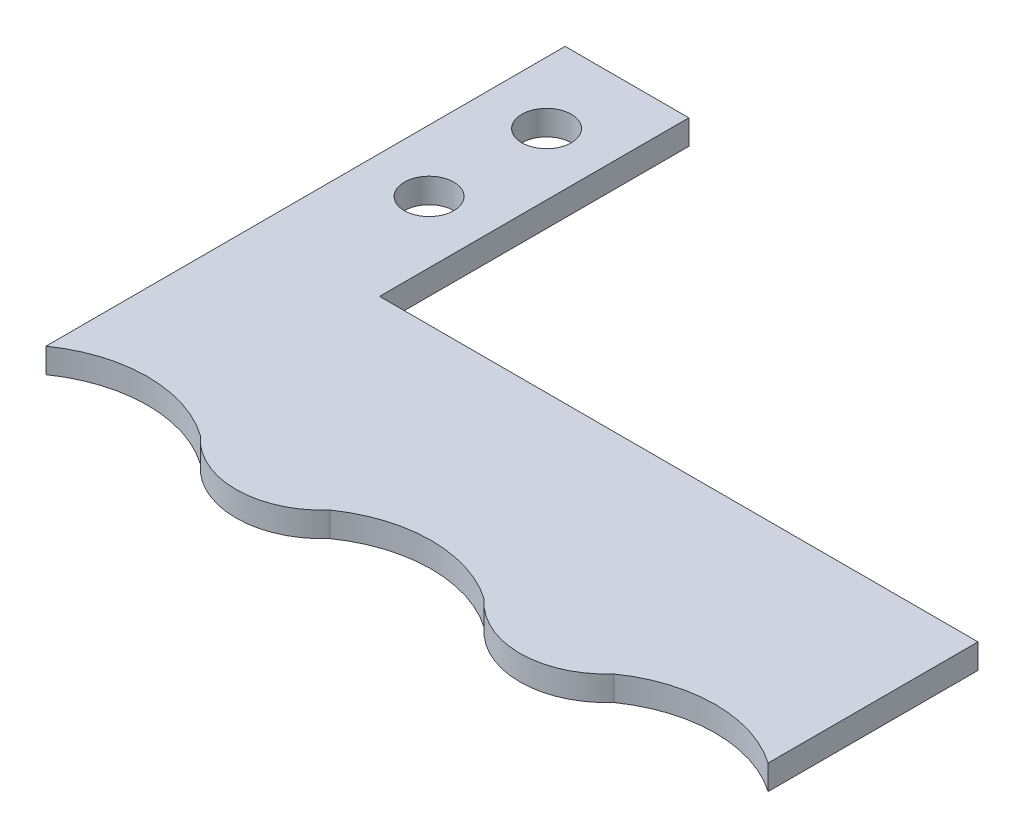
ISO-10303-21;
HEADER;
FILE_DESCRIPTION(('STEP AP214'),'2;1');
FILE_NAME('part.step','',(''),(''),'','','');
FILE_SCHEMA(('AUTOMOTIVE_DESIGN { 1 0 10303 214 1 1 1 1 }'));
ENDSEC;
DATA;
#1=APPLICATION_CONTEXT('core data for automotive mechanical design processes');
#2=APPLICATION_PROTOCOL_DEFINITION('international standard','automotive_design',2000,#1);
#3=PRODUCT_CONTEXT('',#1,'mechanical');
#4=PRODUCT('Part','Part','',(#3));
#5=PRODUCT_RELATED_PRODUCT_CATEGORY('part','',(#4));
#6=PRODUCT_DEFINITION_FORMATION('','',#4);
#7=PRODUCT_DEFINITION_CONTEXT('part definition',#1,'design');
#8=PRODUCT_DEFINITION('design','',#6,#7);
#9=PRODUCT_DEFINITION_SHAPE('','',#8);
#10=(LENGTH_UNIT() NAMED_UNIT(*) SI_UNIT(.MILLI.,.METRE.));
#11=(NAMED_UNIT(*) PLANE_ANGLE_UNIT() SI_UNIT($,.RADIAN.));
#12=(NAMED_UNIT(*) SI_UNIT($,.STERADIAN.) SOLID_ANGLE_UNIT());
#13=UNCERTAINTY_MEASURE_WITH_UNIT(LENGTH_MEASURE(1.E-05),#10,'distance_accuracy_value','');
#14=(GEOMETRIC_REPRESENTATION_CONTEXT(3) GLOBAL_UNCERTAINTY_ASSIGNED_CONTEXT((#13)) GLOBAL_UNIT_ASSIGNED_CONTEXT((#10,
#11,#12)) REPRESENTATION_CONTEXT('',''));
#15=CARTESIAN_POINT('',(0.,0.,0.));
#16=DIRECTION('',(0.,0.,1.));
#17=DIRECTION('',(1.,0.,0.));
#18=AXIS2_PLACEMENT_3D('',#15,#16,#17);
#19=CARTESIAN_POINT('',(-22.95,-2.,0.));
#20=DIRECTION('',(0.,1.,0.));
#21=DIRECTION('',(0.,0.,1.));
#22=AXIS2_PLACEMENT_3D('',#19,#20,#21);
#23=CYLINDRICAL_SURFACE('',#22,10.875);
#24=CARTESIAN_POINT('',(-22.95,0.,0.));
#25=DIRECTION('',(0.,-1.,0.));
#26=DIRECTION('',(0.,0.,-1.));
#27=AXIS2_PLACEMENT_3D('',#24,#25,#26);
#28=CIRCLE('',#27,10.875);
#29=CARTESIAN_POINT('',(-29.1876437453176,0.,-8.9082784816428));
#30=VERTEX_POINT('',#29);
#31=CARTESIAN_POINT('',(-16.7123562546824,0.,-8.9082784816428));
#32=VERTEX_POINT('',#31);
#33=EDGE_CURVE('E152',#30,#32,#28,.T.);
#34=ORIENTED_EDGE('',*,*,#33,.F.);
#35=DIRECTION('',(0.,1.,0.));
#36=VECTOR('',#35,1.);
#37=CARTESIAN_POINT('',(-29.1876437453176,-2.,-8.9082784816428));
#38=LINE('',#37,#36);
#39=CARTESIAN_POINT('',(-29.1876437453176,-2.,-8.9082784816428));
#40=VERTEX_POINT('',#39);
#41=EDGE_CURVE('E11',#40,#30,#38,.T.);
#42=ORIENTED_EDGE('',*,*,#41,.F.);
#43=CARTESIAN_POINT('',(-22.95,-2.,0.));
#44=DIRECTION('',(0.,-1.,0.));
#45=DIRECTION('',(0.,0.,-1.));
#46=AXIS2_PLACEMENT_3D('',#43,#44,#45);
#47=CIRCLE('',#46,10.875);
#48=CARTESIAN_POINT('',(-16.7123562546824,-2.,-8.9082784816428));
#49=VERTEX_POINT('',#48);
#50=EDGE_CURVE('E177',#40,#49,#47,.T.);
#51=ORIENTED_EDGE('',*,*,#50,.T.);
#52=DIRECTION('',(0.,1.,0.));
#53=VECTOR('',#52,1.);
#54=CARTESIAN_POINT('',(-16.7123562546824,-2.,-8.9082784816428));
#55=LINE('',#54,#53);
#56=EDGE_CURVE('E46',#49,#32,#55,.T.);
#57=ORIENTED_EDGE('',*,*,#56,.T.);
#58=EDGE_LOOP('',(#34,#42,#51,#57));
#59=FACE_BOUND('',#58,.T.);
#60=ADVANCED_FACE('F43',(#59),#23,.F.);
#61=CARTESIAN_POINT('',(-29.1876437453176,-2.,-8.9082784816428));
#62=DIRECTION('',(-1.,0.,0.));
#63=DIRECTION('',(0.,0.,1.));
#64=AXIS2_PLACEMENT_3D('',#61,#62,#63);
#65=PLANE('',#64);
#66=DIRECTION('',(0.,0.,1.));
#67=VECTOR('',#66,1.);
#68=CARTESIAN_POINT('',(-29.1876437453176,0.,-8.9082784816428));
#69=LINE('',#68,#67);
#70=CARTESIAN_POINT('',(-29.1876437453176,0.,-50.875));
#71=VERTEX_POINT('',#70);
#72=EDGE_CURVE('E92',#71,#30,#69,.T.);
#73=ORIENTED_EDGE('',*,*,#72,.F.);
#74=DIRECTION('',(0.,1.,0.));
#75=VECTOR('',#74,1.);
#76=CARTESIAN_POINT('',(-29.1876437453176,-2.,-50.875));
#77=LINE('',#76,#75);
#78=CARTESIAN_POINT('',(-29.1876437453176,-2.,-50.875));
#79=VERTEX_POINT('',#78);
#80=EDGE_CURVE('E52',#79,#71,#77,.T.);
#81=ORIENTED_EDGE('',*,*,#80,.F.);
#82=DIRECTION('',(0.,0.,1.));
#83=VECTOR('',#82,1.);
#84=CARTESIAN_POINT('',(-29.1876437453176,-2.,-25.875));
#85=LINE('',#84,#83);
#86=EDGE_CURVE('E60',#79,#40,#85,.T.);
#87=ORIENTED_EDGE('',*,*,#86,.T.);
#88=ORIENTED_EDGE('',*,*,#41,.T.);
#89=EDGE_LOOP('',(#73,#81,#87,#88));
#90=FACE_BOUND('',#89,.T.);
#91=ADVANCED_FACE('F251',(#90),#65,.T.);
#92=CARTESIAN_POINT('',(-29.1876437453176,-2.,-50.875));
#93=DIRECTION('',(0.,0.,-1.));
#94=DIRECTION('',(-1.,0.,0.));
#95=AXIS2_PLACEMENT_3D('',#92,#93,#94);
#96=PLANE('',#95);
#97=DIRECTION('',(-1.,0.,0.));
#98=VECTOR('',#97,1.);
#99=CARTESIAN_POINT('',(-29.1876437453176,0.,-50.875));
#100=LINE('',#99,#98);
#101=CARTESIAN_POINT('',(-19.1876437453176,0.,-50.875));
#102=VERTEX_POINT('',#101);
#103=EDGE_CURVE('E129',#102,#71,#100,.T.);
#104=ORIENTED_EDGE('',*,*,#103,.F.);
#105=DIRECTION('',(0.,1.,0.));
#106=VECTOR('',#105,1.);
#107=CARTESIAN_POINT('',(-19.1876437453176,-2.,-50.875));
#108=LINE('',#107,#106);
#109=CARTESIAN_POINT('',(-19.1876437453176,-2.,-50.875));
#110=VERTEX_POINT('',#109);
#111=EDGE_CURVE('E124',#110,#102,#108,.T.);
#112=ORIENTED_EDGE('',*,*,#111,.F.);
#113=DIRECTION('',(-1.,0.,0.));
#114=VECTOR('',#113,1.);
#115=CARTESIAN_POINT('',(-29.1876437453176,-2.,-50.875));
#116=LINE('',#115,#114);
#117=EDGE_CURVE('E127',#110,#79,#116,.T.);
#118=ORIENTED_EDGE('',*,*,#117,.T.);
#119=ORIENTED_EDGE('',*,*,#80,.T.);
#120=EDGE_LOOP('',(#104,#112,#118,#119));
#121=FACE_BOUND('',#120,.T.);
#122=ADVANCED_FACE('F126',(#121),#96,.T.);
#123=CARTESIAN_POINT('',(-19.1876437453176,-2.,-50.875));
#124=DIRECTION('',(1.,0.,0.));
#125=DIRECTION('',(0.,0.,-1.));
#126=AXIS2_PLACEMENT_3D('',#123,#124,#125);
#127=PLANE('',#126);
#128=DIRECTION('',(0.,0.,-1.));
#129=VECTOR('',#128,1.);
#130=CARTESIAN_POINT('',(-19.1876437453176,0.,-50.875));
#131=LINE('',#130,#129);
#132=CARTESIAN_POINT('',(-19.1876437453176,0.,-25.875));
#133=VERTEX_POINT('',#132);
#134=EDGE_CURVE('E174',#133,#102,#131,.T.);
#135=ORIENTED_EDGE('',*,*,#134,.F.);
#136=DIRECTION('',(0.,1.,0.));
#137=VECTOR('',#136,1.);
#138=CARTESIAN_POINT('',(-19.1876437453176,-2.,-25.875));
#139=LINE('',#138,#137);
#140=CARTESIAN_POINT('',(-19.1876437453176,-2.,-25.875));
#141=VERTEX_POINT('',#140);
#142=EDGE_CURVE('E134',#141,#133,#139,.T.);
#143=ORIENTED_EDGE('',*,*,#142,.F.);
#144=DIRECTION('',(0.,0.,-1.));
#145=VECTOR('',#144,1.);
#146=CARTESIAN_POINT('',(-19.1876437453176,-2.,-50.875));
#147=LINE('',#146,#145);
#148=EDGE_CURVE('E141',#141,#110,#147,.T.);
#149=ORIENTED_EDGE('',*,*,#148,.T.);
#150=ORIENTED_EDGE('',*,*,#111,.T.);
#151=EDGE_LOOP('',(#135,#143,#149,#150));
#152=FACE_BOUND('',#151,.T.);
#153=ADVANCED_FACE('F144',(#152),#127,.T.);
#154=CARTESIAN_POINT('',(-19.1876437453176,-2.,-25.875));
#155=DIRECTION('',(0.,0.,-1.));
#156=DIRECTION('',(-1.,0.,0.));
#157=AXIS2_PLACEMENT_3D('',#154,#155,#156);
#158=PLANE('',#157);
#159=DIRECTION('',(-1.,0.,0.));
#160=VECTOR('',#159,1.);
#161=CARTESIAN_POINT('',(-19.1876437453176,0.,-25.875));
#162=LINE('',#161,#160);
#163=CARTESIAN_POINT('',(29.1876437453176,0.,-25.875));
#164=VERTEX_POINT('',#163);
#165=EDGE_CURVE('E171',#164,#133,#162,.T.);
#166=ORIENTED_EDGE('',*,*,#165,.F.);
#167=DIRECTION('',(0.,1.,0.));
#168=VECTOR('',#167,1.);
#169=CARTESIAN_POINT('',(29.1876437453176,-2.,-25.875));
#170=LINE('',#169,#168);
#171=CARTESIAN_POINT('',(29.1876437453176,-2.,-25.875));
#172=VERTEX_POINT('',#171);
#173=EDGE_CURVE('E181',#172,#164,#170,.T.);
#174=ORIENTED_EDGE('',*,*,#173,.F.);
#175=DIRECTION('',(-1.,0.,0.));
#176=VECTOR('',#175,1.);
#177=CARTESIAN_POINT('',(-19.1876437453176,-2.,-25.875));
#178=LINE('',#177,#176);
#179=EDGE_CURVE('E145',#172,#141,#178,.T.);
#180=ORIENTED_EDGE('',*,*,#179,.T.);
#181=ORIENTED_EDGE('',*,*,#142,.T.);
#182=EDGE_LOOP('',(#166,#174,#180,#181));
#183=FACE_BOUND('',#182,.T.);
#184=ADVANCED_FACE('F198',(#183),#158,.T.);
#185=CARTESIAN_POINT('',(29.1876437453176,-2.,-8.90827848164281));
#186=DIRECTION('',(1.,0.,0.));
#187=DIRECTION('',(0.,0.,-1.));
#188=AXIS2_PLACEMENT_3D('',#185,#186,#187);
#189=PLANE('',#188);
#190=DIRECTION('',(0.,0.,-1.));
#191=VECTOR('',#190,1.);
#192=CARTESIAN_POINT('',(29.1876437453176,0.,-8.90827848164281));
#193=LINE('',#192,#191);
#194=CARTESIAN_POINT('',(29.1876437453176,0.,-8.90827848164281));
#195=VERTEX_POINT('',#194);
#196=EDGE_CURVE('E168',#195,#164,#193,.T.);
#197=ORIENTED_EDGE('',*,*,#196,.F.);
#198=DIRECTION('',(0.,1.,0.));
#199=VECTOR('',#198,1.);
#200=CARTESIAN_POINT('',(29.1876437453176,-2.,-8.90827848164281));
#201=LINE('',#200,#199);
#202=CARTESIAN_POINT('',(29.1876437453176,-2.,-8.90827848164281));
#203=VERTEX_POINT('',#202);
#204=EDGE_CURVE('E183',#203,#195,#201,.T.);
#205=ORIENTED_EDGE('',*,*,#204,.F.);
#206=DIRECTION('',(0.,0.,-1.));
#207=VECTOR('',#206,1.);
#208=CARTESIAN_POINT('',(29.1876437453176,-2.,-8.90827848164281));
#209=LINE('',#208,#207);
#210=EDGE_CURVE('E147',#203,#172,#209,.T.);
#211=ORIENTED_EDGE('',*,*,#210,.T.);
#212=ORIENTED_EDGE('',*,*,#173,.T.);
#213=EDGE_LOOP('',(#197,#205,#211,#212));
#214=FACE_BOUND('',#213,.T.);
#215=ADVANCED_FACE('F204',(#214),#189,.T.);
#216=CARTESIAN_POINT('',(22.95,-2.,0.));
#217=DIRECTION('',(0.,1.,0.));
#218=DIRECTION('',(0.,0.,1.));
#219=AXIS2_PLACEMENT_3D('',#216,#217,#218);
#220=CYLINDRICAL_SURFACE('',#219,10.875);
#221=CARTESIAN_POINT('',(22.95,0.,0.));
#222=DIRECTION('',(0.,-1.,0.));
#223=DIRECTION('',(0.,0.,-1.));
#224=AXIS2_PLACEMENT_3D('',#221,#222,#223);
#225=CIRCLE('',#224,10.875);
#226=CARTESIAN_POINT('',(16.7123562546824,0.,-8.9082784816428));
#227=VERTEX_POINT('',#226);
#228=EDGE_CURVE('E165',#227,#195,#225,.T.);
#229=ORIENTED_EDGE('',*,*,#228,.F.);
#230=DIRECTION('',(0.,1.,0.));
#231=VECTOR('',#230,1.);
#232=CARTESIAN_POINT('',(16.7123562546824,-2.,-8.9082784816428));
#233=LINE('',#232,#231);
#234=CARTESIAN_POINT('',(16.7123562546824,-2.,-8.9082784816428));
#235=VERTEX_POINT('',#234);
#236=EDGE_CURVE('E185',#235,#227,#233,.T.);
#237=ORIENTED_EDGE('',*,*,#236,.F.);
#238=CARTESIAN_POINT('',(22.95,-2.,0.));
#239=DIRECTION('',(0.,-1.,0.));
#240=DIRECTION('',(0.,0.,-1.));
#241=AXIS2_PLACEMENT_3D('',#238,#239,#240);
#242=CIRCLE('',#241,10.875);
#243=EDGE_CURVE('E205',#235,#203,#242,.T.);
#244=ORIENTED_EDGE('',*,*,#243,.T.);
#245=ORIENTED_EDGE('',*,*,#204,.T.);
#246=EDGE_LOOP('',(#229,#237,#244,#245));
#247=FACE_BOUND('',#246,.T.);
#248=ADVANCED_FACE('F267',(#247),#220,.F.);
#249=CARTESIAN_POINT('',(11.475,-2.,-13.5526405973202));
#250=DIRECTION('',(0.,1.,0.));
#251=DIRECTION('',(0.,0.,1.));
#252=AXIS2_PLACEMENT_3D('',#249,#250,#251);
#253=CYLINDRICAL_SURFACE('',#252,7.);
#254=CARTESIAN_POINT('',(11.475,0.,-13.5526405973202));
#255=DIRECTION('',(0.,1.,0.));
#256=DIRECTION('',(0.,0.,1.));
#257=AXIS2_PLACEMENT_3D('',#254,#255,#256);
#258=CIRCLE('',#257,7.);
#259=CARTESIAN_POINT('',(6.2376437453176,0.,-8.9082784816428));
#260=VERTEX_POINT('',#259);
#261=EDGE_CURVE('E162',#260,#227,#258,.T.);
#262=ORIENTED_EDGE('',*,*,#261,.F.);
#263=DIRECTION('',(0.,1.,0.));
#264=VECTOR('',#263,1.);
#265=CARTESIAN_POINT('',(6.2376437453176,-2.,-8.9082784816428));
#266=LINE('',#265,#264);
#267=CARTESIAN_POINT('',(6.2376437453176,-2.,-8.9082784816428));
#268=VERTEX_POINT('',#267);
#269=EDGE_CURVE('E187',#268,#260,#266,.T.);
#270=ORIENTED_EDGE('',*,*,#269,.F.);
#271=CARTESIAN_POINT('',(11.475,-2.,-13.5526405973202));
#272=DIRECTION('',(0.,1.,0.));
#273=DIRECTION('',(0.,0.,1.));
#274=AXIS2_PLACEMENT_3D('',#271,#272,#273);
#275=CIRCLE('',#274,7.);
#276=EDGE_CURVE('E206',#268,#235,#275,.T.);
#277=ORIENTED_EDGE('',*,*,#276,.T.);
#278=ORIENTED_EDGE('',*,*,#236,.T.);
#279=EDGE_LOOP('',(#262,#270,#277,#278));
#280=FACE_BOUND('',#279,.T.);
#281=ADVANCED_FACE('F270',(#280),#253,.T.);
#282=CARTESIAN_POINT('',(0.,-2.,0.));
#283=DIRECTION('',(0.,1.,0.));
#284=DIRECTION('',(0.,0.,1.));
#285=AXIS2_PLACEMENT_3D('',#282,#283,#284);
#286=CYLINDRICAL_SURFACE('',#285,10.875);
#287=CARTESIAN_POINT('',(0.,0.,0.));
#288=DIRECTION('',(0.,-1.,0.));
#289=DIRECTION('',(0.,0.,-1.));
#290=AXIS2_PLACEMENT_3D('',#287,#288,#289);
#291=CIRCLE('',#290,10.875);
#292=CARTESIAN_POINT('',(-6.23764374531761,0.,-8.90827848164279));
#293=VERTEX_POINT('',#292);
#294=EDGE_CURVE('E159',#293,#260,#291,.T.);
#295=ORIENTED_EDGE('',*,*,#294,.F.);
#296=DIRECTION('',(0.,1.,0.));
#297=VECTOR('',#296,1.);
#298=CARTESIAN_POINT('',(-6.23764374531761,-2.,-8.90827848164279));
#299=LINE('',#298,#297);
#300=CARTESIAN_POINT('',(-6.23764374531761,-2.,-8.90827848164279));
#301=VERTEX_POINT('',#300);
#302=EDGE_CURVE('E188',#301,#293,#299,.T.);
#303=ORIENTED_EDGE('',*,*,#302,.F.);
#304=CARTESIAN_POINT('',(0.,-2.,0.));
#305=DIRECTION('',(0.,-1.,0.));
#306=DIRECTION('',(0.,0.,-1.));
#307=AXIS2_PLACEMENT_3D('',#304,#305,#306);
#308=CIRCLE('',#307,10.875);
#309=EDGE_CURVE('E211',#301,#268,#308,.T.);
#310=ORIENTED_EDGE('',*,*,#309,.T.);
#311=ORIENTED_EDGE('',*,*,#269,.T.);
#312=EDGE_LOOP('',(#295,#303,#310,#311));
#313=FACE_BOUND('',#312,.T.);
#314=ADVANCED_FACE('F249',(#313),#286,.F.);
#315=CARTESIAN_POINT('',(-11.475,-2.,-13.5526405973202));
#316=DIRECTION('',(0.,1.,0.));
#317=DIRECTION('',(0.,0.,1.));
#318=AXIS2_PLACEMENT_3D('',#315,#316,#317);
#319=CYLINDRICAL_SURFACE('',#318,7.);
#320=CARTESIAN_POINT('',(-11.475,0.,-13.5526405973202));
#321=DIRECTION('',(0.,1.,0.));
#322=DIRECTION('',(0.,0.,1.));
#323=AXIS2_PLACEMENT_3D('',#320,#321,#322);
#324=CIRCLE('',#323,7.);
#325=EDGE_CURVE('E155',#32,#293,#324,.T.);
#326=ORIENTED_EDGE('',*,*,#325,.F.);
#327=ORIENTED_EDGE('',*,*,#56,.F.);
#328=CARTESIAN_POINT('',(-11.475,-2.,-13.5526405973202));
#329=DIRECTION('',(0.,1.,0.));
#330=DIRECTION('',(0.,0.,1.));
#331=AXIS2_PLACEMENT_3D('',#328,#329,#330);
#332=CIRCLE('',#331,7.);
#333=EDGE_CURVE('E214',#49,#301,#332,.T.);
#334=ORIENTED_EDGE('',*,*,#333,.T.);
#335=ORIENTED_EDGE('',*,*,#302,.T.);
#336=EDGE_LOOP('',(#326,#327,#334,#335));
#337=FACE_BOUND('',#336,.T.);
#338=ADVANCED_FACE('F192',(#337),#319,.T.);
#339=CARTESIAN_POINT('',(-22.95,-2.,0.));
#340=DIRECTION('',(0.,-1.,0.));
#341=DIRECTION('',(0.,0.,-1.));
#342=AXIS2_PLACEMENT_3D('',#339,#340,#341);
#343=PLANE('',#342);
#344=CARTESIAN_POINT('',(-24.1876437453176,-2.,-44.375));
#345=DIRECTION('',(0.,-1.,0.));
#346=DIRECTION('',(0.,0.,-1.));
#347=AXIS2_PLACEMENT_3D('',#344,#345,#346);
#348=CIRCLE('',#347,2.);
#349=CARTESIAN_POINT('',(-24.1876437453176,-2.,-42.375));
#350=VERTEX_POINT('',#349);
#351=EDGE_CURVE('E156',#350,#350,#348,.F.);
#352=ORIENTED_EDGE('',*,*,#351,.T.);
#353=EDGE_LOOP('',(#352));
#354=FACE_BOUND('',#353,.T.);
#355=CARTESIAN_POINT('',(-24.1876437453176,-2.,-34.875));
#356=DIRECTION('',(0.,-1.,0.));
#357=DIRECTION('',(0.,0.,-1.));
#358=AXIS2_PLACEMENT_3D('',#355,#356,#357);
#359=CIRCLE('',#358,2.);
#360=CARTESIAN_POINT('',(-24.1876437453176,-2.,-32.875));
#361=VERTEX_POINT('',#360);
#362=EDGE_CURVE('E221',#361,#361,#359,.F.);
#363=ORIENTED_EDGE('',*,*,#362,.T.);
#364=EDGE_LOOP('',(#363));
#365=FACE_BOUND('',#364,.T.);
#366=ORIENTED_EDGE('',*,*,#50,.F.);
#367=ORIENTED_EDGE('',*,*,#86,.F.);
#368=ORIENTED_EDGE('',*,*,#117,.F.);
#369=ORIENTED_EDGE('',*,*,#148,.F.);
#370=ORIENTED_EDGE('',*,*,#179,.F.);
#371=ORIENTED_EDGE('',*,*,#210,.F.);
#372=ORIENTED_EDGE('',*,*,#243,.F.);
#373=ORIENTED_EDGE('',*,*,#276,.F.);
#374=ORIENTED_EDGE('',*,*,#309,.F.);
#375=ORIENTED_EDGE('',*,*,#333,.F.);
#376=EDGE_LOOP('',(#366,#367,#368,#369,#370,#371,#372,#373,#374,#375));
#377=FACE_BOUND('',#376,.T.);
#378=ADVANCED_FACE('F139',(#354,#365,#377),#343,.T.);
#379=CARTESIAN_POINT('',(-22.95,0.,0.));
#380=DIRECTION('',(0.,-1.,0.));
#381=DIRECTION('',(0.,0.,-1.));
#382=AXIS2_PLACEMENT_3D('',#379,#380,#381);
#383=PLANE('',#382);
#384=CARTESIAN_POINT('',(-24.1876437453176,0.,-44.375));
#385=DIRECTION('',(0.,1.,0.));
#386=DIRECTION('',(0.,0.,1.));
#387=AXIS2_PLACEMENT_3D('',#384,#385,#386);
#388=CIRCLE('',#387,2.);
#389=CARTESIAN_POINT('',(-24.1876437453176,0.,-42.375));
#390=VERTEX_POINT('',#389);
#391=EDGE_CURVE('E220',#390,#390,#388,.T.);
#392=ORIENTED_EDGE('',*,*,#391,.F.);
#393=EDGE_LOOP('',(#392));
#394=FACE_BOUND('',#393,.T.);
#395=CARTESIAN_POINT('',(-24.1876437453176,0.,-34.875));
#396=DIRECTION('',(0.,1.,0.));
#397=DIRECTION('',(0.,0.,1.));
#398=AXIS2_PLACEMENT_3D('',#395,#396,#397);
#399=CIRCLE('',#398,2.);
#400=CARTESIAN_POINT('',(-24.1876437453176,0.,-32.875));
#401=VERTEX_POINT('',#400);
#402=EDGE_CURVE('E217',#401,#401,#399,.T.);
#403=ORIENTED_EDGE('',*,*,#402,.F.);
#404=EDGE_LOOP('',(#403));
#405=FACE_BOUND('',#404,.T.);
#406=ORIENTED_EDGE('',*,*,#33,.T.);
#407=ORIENTED_EDGE('',*,*,#325,.T.);
#408=ORIENTED_EDGE('',*,*,#294,.T.);
#409=ORIENTED_EDGE('',*,*,#261,.T.);
#410=ORIENTED_EDGE('',*,*,#228,.T.);
#411=ORIENTED_EDGE('',*,*,#196,.T.);
#412=ORIENTED_EDGE('',*,*,#165,.T.);
#413=ORIENTED_EDGE('',*,*,#134,.T.);
#414=ORIENTED_EDGE('',*,*,#103,.T.);
#415=ORIENTED_EDGE('',*,*,#72,.T.);
#416=EDGE_LOOP('',(#406,#407,#408,#409,#410,#411,#412,#413,#414,#415));
#417=FACE_BOUND('',#416,.T.);
#418=ADVANCED_FACE('F194',(#394,#405,#417),#383,.F.);
#419=CARTESIAN_POINT('',(-24.1876437453176,-7.65685424949238,-34.875));
#420=DIRECTION('',(0.,1.,0.));
#421=DIRECTION('',(0.,0.,1.));
#422=AXIS2_PLACEMENT_3D('',#419,#420,#421);
#423=CYLINDRICAL_SURFACE('',#422,2.);
#424=CARTESIAN_POINT('',(-24.1876437453176,0.,-32.875));
#425=CARTESIAN_POINT('',(-24.1876437453176,-0.0208333333333342,-32.875));
#426=CARTESIAN_POINT('',(-24.1876437453176,-0.0416666666666676,-32.875));
#427=CARTESIAN_POINT('',(-24.1876437453176,-0.0833333333333343,-32.875));
#428=CARTESIAN_POINT('',(-24.1876437453176,-0.104166666666668,-32.875));
#429=CARTESIAN_POINT('',(-24.1876437453176,-0.145833333333334,-32.875));
#430=CARTESIAN_POINT('',(-24.1876437453176,-0.166666666666668,-32.875));
#431=CARTESIAN_POINT('',(-24.1876437453176,-0.208333333333334,-32.875));
#432=CARTESIAN_POINT('',(-24.1876437453176,-0.229166666666668,-32.875));
#433=CARTESIAN_POINT('',(-24.1876437453176,-0.270833333333334,-32.875));
#434=CARTESIAN_POINT('',(-24.1876437453176,-0.291666666666667,-32.875));
#435=CARTESIAN_POINT('',(-24.1876437453176,-0.333333333333334,-32.875));
#436=CARTESIAN_POINT('',(-24.1876437453176,-0.354166666666667,-32.875));
#437=CARTESIAN_POINT('',(-24.1876437453176,-0.395833333333334,-32.875));
#438=CARTESIAN_POINT('',(-24.1876437453176,-0.416666666666667,-32.875));
#439=CARTESIAN_POINT('',(-24.1876437453176,-0.458333333333334,-32.875));
#440=CARTESIAN_POINT('',(-24.1876437453176,-0.479166666666667,-32.875));
#441=CARTESIAN_POINT('',(-24.1876437453176,-0.520833333333334,-32.875));
#442=CARTESIAN_POINT('',(-24.1876437453176,-0.541666666666667,-32.875));
#443=CARTESIAN_POINT('',(-24.1876437453176,-0.583333333333334,-32.875));
#444=CARTESIAN_POINT('',(-24.1876437453176,-0.604166666666667,-32.875));
#445=CARTESIAN_POINT('',(-24.1876437453176,-0.645833333333334,-32.875));
#446=CARTESIAN_POINT('',(-24.1876437453176,-0.666666666666667,-32.875));
#447=CARTESIAN_POINT('',(-24.1876437453176,-0.708333333333334,-32.875));
#448=CARTESIAN_POINT('',(-24.1876437453176,-0.729166666666667,-32.875));
#449=CARTESIAN_POINT('',(-24.1876437453176,-0.770833333333333,-32.875));
#450=CARTESIAN_POINT('',(-24.1876437453176,-0.791666666666667,-32.875));
#451=CARTESIAN_POINT('',(-24.1876437453176,-0.833333333333333,-32.875));
#452=CARTESIAN_POINT('',(-24.1876437453176,-0.854166666666667,-32.875));
#453=CARTESIAN_POINT('',(-24.1876437453176,-0.895833333333333,-32.875));
#454=CARTESIAN_POINT('',(-24.1876437453176,-0.916666666666667,-32.875));
#455=CARTESIAN_POINT('',(-24.1876437453176,-0.958333333333333,-32.875));
#456=CARTESIAN_POINT('',(-24.1876437453176,-0.979166666666667,-32.875));
#457=CARTESIAN_POINT('',(-24.1876437453176,-1.02083333333333,-32.875));
#458=CARTESIAN_POINT('',(-24.1876437453176,-1.04166666666667,-32.875));
#459=CARTESIAN_POINT('',(-24.1876437453176,-1.08333333333333,-32.875));
#460=CARTESIAN_POINT('',(-24.1876437453176,-1.10416666666667,-32.875));
#461=CARTESIAN_POINT('',(-24.1876437453176,-1.14583333333333,-32.875));
#462=CARTESIAN_POINT('',(-24.1876437453176,-1.16666666666667,-32.875));
#463=CARTESIAN_POINT('',(-24.1876437453176,-1.20833333333333,-32.875));
#464=CARTESIAN_POINT('',(-24.1876437453176,-1.22916666666667,-32.875));
#465=CARTESIAN_POINT('',(-24.1876437453176,-1.27083333333333,-32.875));
#466=CARTESIAN_POINT('',(-24.1876437453176,-1.29166666666667,-32.875));
#467=CARTESIAN_POINT('',(-24.1876437453176,-1.33333333333333,-32.875));
#468=CARTESIAN_POINT('',(-24.1876437453176,-1.35416666666667,-32.875));
#469=CARTESIAN_POINT('',(-24.1876437453176,-1.39583333333333,-32.875));
#470=CARTESIAN_POINT('',(-24.1876437453176,-1.41666666666667,-32.875));
#471=CARTESIAN_POINT('',(-24.1876437453176,-1.45833333333333,-32.875));
#472=CARTESIAN_POINT('',(-24.1876437453176,-1.47916666666667,-32.875));
#473=CARTESIAN_POINT('',(-24.1876437453176,-1.52083333333333,-32.875));
#474=CARTESIAN_POINT('',(-24.1876437453176,-1.54166666666667,-32.875));
#475=CARTESIAN_POINT('',(-24.1876437453176,-1.58333333333333,-32.875));
#476=CARTESIAN_POINT('',(-24.1876437453176,-1.60416666666667,-32.875));
#477=CARTESIAN_POINT('',(-24.1876437453176,-1.64583333333333,-32.875));
#478=CARTESIAN_POINT('',(-24.1876437453176,-1.66666666666667,-32.875));
#479=CARTESIAN_POINT('',(-24.1876437453176,-1.70833333333333,-32.875));
#480=CARTESIAN_POINT('',(-24.1876437453176,-1.72916666666667,-32.875));
#481=CARTESIAN_POINT('',(-24.1876437453176,-1.77083333333333,-32.875));
#482=CARTESIAN_POINT('',(-24.1876437453176,-1.79166666666667,-32.875));
#483=CARTESIAN_POINT('',(-24.1876437453176,-1.83333333333333,-32.875));
#484=CARTESIAN_POINT('',(-24.1876437453176,-1.85416666666667,-32.875));
#485=CARTESIAN_POINT('',(-24.1876437453176,-1.89583333333333,-32.875));
#486=CARTESIAN_POINT('',(-24.1876437453176,-1.91666666666667,-32.875));
#487=CARTESIAN_POINT('',(-24.1876437453176,-1.95833333333333,-32.875));
#488=CARTESIAN_POINT('',(-24.1876437453176,-1.97916666666667,-32.875));
#489=CARTESIAN_POINT('',(-24.1876437453176,-2.,-32.875));
#490=B_SPLINE_CURVE_WITH_KNOTS('',3,(#424,#425,#426,#427,#428,#429,#430,#431,#432,#433,#434,
#435,#436,#437,#438,#439,#440,#441,#442,#443,#444,#445,#446,#447,#448,#449,#450,#451,#452,#453,
#454,#455,#456,#457,#458,#459,#460,#461,#462,#463,#464,#465,#466,#467,#468,#469,#470,#471,#472,
#473,#474,#475,#476,#477,#478,#479,#480,#481,#482,#483,#484,#485,#486,#487,#488,#489),
.UNSPECIFIED.,.F.,.F.,(4,2,2,2,2,2,2,2,2,2,2,2,2,2,2,2,2,2,2,2,2,2,2,2,2,2,2,2,2,2,2,2,4),(0.,
0.0625000000000001,0.125,0.1875,0.25,0.312499999999999,0.374999999999999,0.4375,0.5,0.5625,
0.625,0.6875,0.749999999999999,0.812499999999999,0.874999999999999,0.937499999999999,
0.999999999999999,1.0625,1.125,1.1875,1.25,1.3125,1.375,1.4375,1.5,1.5625,1.625,1.6875,1.75,
1.8125,1.875,1.9375,2.),.UNSPECIFIED.);
#491=EDGE_CURVE('BSEAM234',#401,#361,#490,.T.);
#492=ORIENTED_EDGE('',*,*,#402,.T.);
#493=ORIENTED_EDGE('',*,*,#362,.F.);
#494=ORIENTED_EDGE('',*,*,#491,.T.);
#495=ORIENTED_EDGE('',*,*,#491,.F.);
#496=EDGE_LOOP('',(#492,#494,#493,#495));
#497=FACE_BOUND('',#496,.T.);
#498=ADVANCED_FACE('F234',(#497),#423,.F.);
#499=CARTESIAN_POINT('',(-24.1876437453176,-7.65685424949238,-44.375));
#500=DIRECTION('',(0.,1.,0.));
#501=DIRECTION('',(0.,0.,1.));
#502=AXIS2_PLACEMENT_3D('',#499,#500,#501);
#503=CYLINDRICAL_SURFACE('',#502,2.);
#504=CARTESIAN_POINT('',(-24.1876437453176,0.,-42.375));
#505=CARTESIAN_POINT('',(-24.1876437453176,-0.0208333333333342,-42.375));
#506=CARTESIAN_POINT('',(-24.1876437453176,-0.0416666666666676,-42.375));
#507=CARTESIAN_POINT('',(-24.1876437453176,-0.0833333333333343,-42.375));
#508=CARTESIAN_POINT('',(-24.1876437453176,-0.104166666666668,-42.375));
#509=CARTESIAN_POINT('',(-24.1876437453176,-0.145833333333334,-42.375));
#510=CARTESIAN_POINT('',(-24.1876437453176,-0.166666666666668,-42.375));
#511=CARTESIAN_POINT('',(-24.1876437453176,-0.208333333333334,-42.375));
#512=CARTESIAN_POINT('',(-24.1876437453176,-0.229166666666668,-42.375));
#513=CARTESIAN_POINT('',(-24.1876437453176,-0.270833333333334,-42.375));
#514=CARTESIAN_POINT('',(-24.1876437453176,-0.291666666666667,-42.375));
#515=CARTESIAN_POINT('',(-24.1876437453176,-0.333333333333334,-42.375));
#516=CARTESIAN_POINT('',(-24.1876437453176,-0.354166666666667,-42.375));
#517=CARTESIAN_POINT('',(-24.1876437453176,-0.395833333333334,-42.375));
#518=CARTESIAN_POINT('',(-24.1876437453176,-0.416666666666667,-42.375));
#519=CARTESIAN_POINT('',(-24.1876437453176,-0.458333333333334,-42.375));
#520=CARTESIAN_POINT('',(-24.1876437453176,-0.479166666666667,-42.375));
#521=CARTESIAN_POINT('',(-24.1876437453176,-0.520833333333334,-42.375));
#522=CARTESIAN_POINT('',(-24.1876437453176,-0.541666666666667,-42.375));
#523=CARTESIAN_POINT('',(-24.1876437453176,-0.583333333333334,-42.375));
#524=CARTESIAN_POINT('',(-24.1876437453176,-0.604166666666667,-42.375));
#525=CARTESIAN_POINT('',(-24.1876437453176,-0.645833333333334,-42.375));
#526=CARTESIAN_POINT('',(-24.1876437453176,-0.666666666666667,-42.375));
#527=CARTESIAN_POINT('',(-24.1876437453176,-0.708333333333334,-42.375));
#528=CARTESIAN_POINT('',(-24.1876437453176,-0.729166666666667,-42.375));
#529=CARTESIAN_POINT('',(-24.1876437453176,-0.770833333333333,-42.375));
#530=CARTESIAN_POINT('',(-24.1876437453176,-0.791666666666667,-42.375));
#531=CARTESIAN_POINT('',(-24.1876437453176,-0.833333333333333,-42.375));
#532=CARTESIAN_POINT('',(-24.1876437453176,-0.854166666666667,-42.375));
#533=CARTESIAN_POINT('',(-24.1876437453176,-0.895833333333333,-42.375));
#534=CARTESIAN_POINT('',(-24.1876437453176,-0.916666666666667,-42.375));
#535=CARTESIAN_POINT('',(-24.1876437453176,-0.958333333333333,-42.375));
#536=CARTESIAN_POINT('',(-24.1876437453176,-0.979166666666667,-42.375));
#537=CARTESIAN_POINT('',(-24.1876437453176,-1.02083333333333,-42.375));
#538=CARTESIAN_POINT('',(-24.1876437453176,-1.04166666666667,-42.375));
#539=CARTESIAN_POINT('',(-24.1876437453176,-1.08333333333333,-42.375));
#540=CARTESIAN_POINT('',(-24.1876437453176,-1.10416666666667,-42.375));
#541=CARTESIAN_POINT('',(-24.1876437453176,-1.14583333333333,-42.375));
#542=CARTESIAN_POINT('',(-24.1876437453176,-1.16666666666667,-42.375));
#543=CARTESIAN_POINT('',(-24.1876437453176,-1.20833333333333,-42.375));
#544=CARTESIAN_POINT('',(-24.1876437453176,-1.22916666666667,-42.375));
#545=CARTESIAN_POINT('',(-24.1876437453176,-1.27083333333333,-42.375));
#546=CARTESIAN_POINT('',(-24.1876437453176,-1.29166666666667,-42.375));
#547=CARTESIAN_POINT('',(-24.1876437453176,-1.33333333333333,-42.375));
#548=CARTESIAN_POINT('',(-24.1876437453176,-1.35416666666667,-42.375));
#549=CARTESIAN_POINT('',(-24.1876437453176,-1.39583333333333,-42.375));
#550=CARTESIAN_POINT('',(-24.1876437453176,-1.41666666666667,-42.375));
#551=CARTESIAN_POINT('',(-24.1876437453176,-1.45833333333333,-42.375));
#552=CARTESIAN_POINT('',(-24.1876437453176,-1.47916666666667,-42.375));
#553=CARTESIAN_POINT('',(-24.1876437453176,-1.52083333333333,-42.375));
#554=CARTESIAN_POINT('',(-24.1876437453176,-1.54166666666667,-42.375));
#555=CARTESIAN_POINT('',(-24.1876437453176,-1.58333333333333,-42.375));
#556=CARTESIAN_POINT('',(-24.1876437453176,-1.60416666666667,-42.375));
#557=CARTESIAN_POINT('',(-24.1876437453176,-1.64583333333333,-42.375));
#558=CARTESIAN_POINT('',(-24.1876437453176,-1.66666666666667,-42.375));
#559=CARTESIAN_POINT('',(-24.1876437453176,-1.70833333333333,-42.375));
#560=CARTESIAN_POINT('',(-24.1876437453176,-1.72916666666667,-42.375));
#561=CARTESIAN_POINT('',(-24.1876437453176,-1.77083333333333,-42.375));
#562=CARTESIAN_POINT('',(-24.1876437453176,-1.79166666666667,-42.375));
#563=CARTESIAN_POINT('',(-24.1876437453176,-1.83333333333333,-42.375));
#564=CARTESIAN_POINT('',(-24.1876437453176,-1.85416666666667,-42.375));
#565=CARTESIAN_POINT('',(-24.1876437453176,-1.89583333333333,-42.375));
#566=CARTESIAN_POINT('',(-24.1876437453176,-1.91666666666667,-42.375));
#567=CARTESIAN_POINT('',(-24.1876437453176,-1.95833333333333,-42.375));
#568=CARTESIAN_POINT('',(-24.1876437453176,-1.97916666666667,-42.375));
#569=CARTESIAN_POINT('',(-24.1876437453176,-2.,-42.375));
#570=B_SPLINE_CURVE_WITH_KNOTS('',3,(#504,#505,#506,#507,#508,#509,#510,#511,#512,#513,#514,
#515,#516,#517,#518,#519,#520,#521,#522,#523,#524,#525,#526,#527,#528,#529,#530,#531,#532,#533,
#534,#535,#536,#537,#538,#539,#540,#541,#542,#543,#544,#545,#546,#547,#548,#549,#550,#551,#552,
#553,#554,#555,#556,#557,#558,#559,#560,#561,#562,#563,#564,#565,#566,#567,#568,#569),
.UNSPECIFIED.,.F.,.F.,(4,2,2,2,2,2,2,2,2,2,2,2,2,2,2,2,2,2,2,2,2,2,2,2,2,2,2,2,2,2,2,2,4),(0.,
0.0625000000000001,0.125,0.1875,0.25,0.312499999999999,0.374999999999999,0.4375,0.5,0.5625,
0.625,0.6875,0.749999999999999,0.812499999999999,0.874999999999999,0.937499999999999,
0.999999999999999,1.0625,1.125,1.1875,1.25,1.3125,1.375,1.4375,1.5,1.5625,1.625,1.6875,1.75,
1.8125,1.875,1.9375,2.),.UNSPECIFIED.);
#571=EDGE_CURVE('BSEAM229',#390,#350,#570,.T.);
#572=ORIENTED_EDGE('',*,*,#391,.T.);
#573=ORIENTED_EDGE('',*,*,#351,.F.);
#574=ORIENTED_EDGE('',*,*,#571,.T.);
#575=ORIENTED_EDGE('',*,*,#571,.F.);
#576=EDGE_LOOP('',(#572,#574,#573,#575));
#577=FACE_BOUND('',#576,.T.);
#578=ADVANCED_FACE('F229',(#577),#503,.F.);
#579=CLOSED_SHELL('',(#60,#91,#122,#153,#184,#215,#248,#281,#314,#338,#378,#418,#498,#578));
#580=MANIFOLD_SOLID_BREP('B2',#579);
#581=ADVANCED_BREP_SHAPE_REPRESENTATION('',(#18,#580),#14);
#582=SHAPE_DEFINITION_REPRESENTATION(#9,#581);
ENDSEC;
END-ISO-10303-21;
